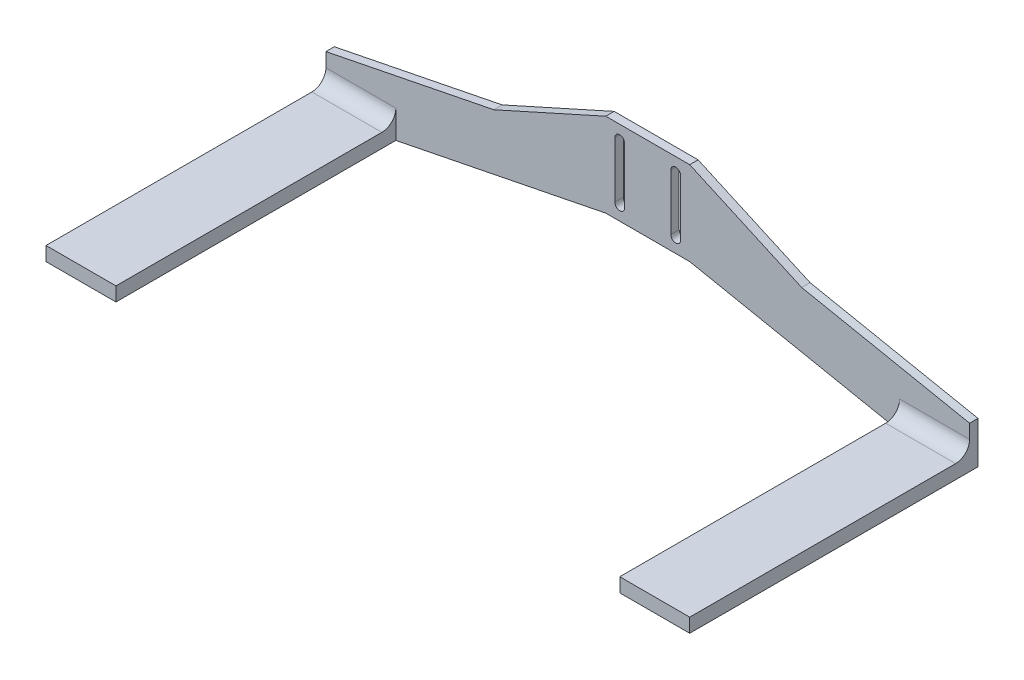
ISO-10303-21;
HEADER;
FILE_DESCRIPTION(('STEP AP214'),'2;1');
FILE_NAME('part.step','',(''),(''),'','','');
FILE_SCHEMA(('AUTOMOTIVE_DESIGN { 1 0 10303 214 1 1 1 1 }'));
ENDSEC;
DATA;
#1=APPLICATION_CONTEXT('core data for automotive mechanical design processes');
#2=APPLICATION_PROTOCOL_DEFINITION('international standard','automotive_design',2000,#1);
#3=PRODUCT_CONTEXT('',#1,'mechanical');
#4=PRODUCT('Part','Part','',(#3));
#5=PRODUCT_RELATED_PRODUCT_CATEGORY('part','',(#4));
#6=PRODUCT_DEFINITION_FORMATION('','',#4);
#7=PRODUCT_DEFINITION_CONTEXT('part definition',#1,'design');
#8=PRODUCT_DEFINITION('design','',#6,#7);
#9=PRODUCT_DEFINITION_SHAPE('','',#8);
#10=(LENGTH_UNIT() NAMED_UNIT(*) SI_UNIT(.MILLI.,.METRE.));
#11=(NAMED_UNIT(*) PLANE_ANGLE_UNIT() SI_UNIT($,.RADIAN.));
#12=(NAMED_UNIT(*) SI_UNIT($,.STERADIAN.) SOLID_ANGLE_UNIT());
#13=UNCERTAINTY_MEASURE_WITH_UNIT(LENGTH_MEASURE(1.E-05),#10,'distance_accuracy_value','');
#14=(GEOMETRIC_REPRESENTATION_CONTEXT(3) GLOBAL_UNCERTAINTY_ASSIGNED_CONTEXT((#13)) GLOBAL_UNIT_ASSIGNED_CONTEXT((#10,
#11,#12)) REPRESENTATION_CONTEXT('',''));
#15=CARTESIAN_POINT('',(0.,0.,0.));
#16=DIRECTION('',(0.,0.,1.));
#17=DIRECTION('',(1.,0.,0.));
#18=AXIS2_PLACEMENT_3D('',#15,#16,#17);
#19=CARTESIAN_POINT('',(0.,0.,3.));
#20=DIRECTION('',(0.,0.,1.));
#21=DIRECTION('',(1.,0.,0.));
#22=AXIS2_PLACEMENT_3D('',#19,#20,#21);
#23=PLANE('',#22);
#24=DIRECTION('',(0.,1.,0.));
#25=VECTOR('',#24,1.);
#26=CARTESIAN_POINT('',(90.,-30.,3.));
#27=LINE('',#26,#25);
#28=CARTESIAN_POINT('',(90.,-30.,3.));
#29=VERTEX_POINT('',#28);
#30=CARTESIAN_POINT('',(90.,-20.,3.));
#31=VERTEX_POINT('',#30);
#32=EDGE_CURVE('E238',#29,#31,#27,.T.);
#33=ORIENTED_EDGE('',*,*,#32,.T.);
#34=DIRECTION('',(1.,0.,0.));
#35=VECTOR('',#34,1.);
#36=CARTESIAN_POINT('',(115.,-20.,3.));
#37=LINE('',#36,#35);
#38=CARTESIAN_POINT('',(115.,-20.,3.));
#39=VERTEX_POINT('',#38);
#40=EDGE_CURVE('E357',#31,#39,#37,.T.);
#41=ORIENTED_EDGE('',*,*,#40,.T.);
#42=DIRECTION('',(0.,1.,0.));
#43=VECTOR('',#42,1.);
#44=CARTESIAN_POINT('',(115.,-1.06396373193244E-13,3.));
#45=LINE('',#44,#43);
#46=CARTESIAN_POINT('',(115.,-15.,3.));
#47=VERTEX_POINT('',#46);
#48=EDGE_CURVE('E380',#39,#47,#45,.T.);
#49=ORIENTED_EDGE('',*,*,#48,.T.);
#50=DIRECTION('',(-0.98058067569092,0.196116135138184,0.));
#51=VECTOR('',#50,1.);
#52=CARTESIAN_POINT('',(1.53846153846154,7.69230769230769,3.));
#53=LINE('',#52,#51);
#54=CARTESIAN_POINT('',(55.,-3.,3.));
#55=VERTEX_POINT('',#54);
#56=EDGE_CURVE('E386',#47,#55,#53,.T.);
#57=ORIENTED_EDGE('',*,*,#56,.T.);
#58=DIRECTION('',(-0.911921505175107,0.410364677328798,0.));
#59=VECTOR('',#58,1.);
#60=CARTESIAN_POINT('',(8.13929313929313,18.0873180873181,3.));
#61=LINE('',#60,#59);
#62=CARTESIAN_POINT('',(15.,15.,3.));
#63=VERTEX_POINT('',#62);
#64=EDGE_CURVE('E389',#55,#63,#61,.T.);
#65=ORIENTED_EDGE('',*,*,#64,.T.);
#66=DIRECTION('',(1.,0.,0.));
#67=VECTOR('',#66,1.);
#68=CARTESIAN_POINT('',(0.,15.,3.));
#69=LINE('',#68,#67);
#70=CARTESIAN_POINT('',(-15.,15.,3.));
#71=VERTEX_POINT('',#70);
#72=EDGE_CURVE('E396',#71,#63,#69,.T.);
#73=ORIENTED_EDGE('',*,*,#72,.F.);
#74=DIRECTION('',(0.911921505175106,0.410364677328798,0.));
#75=VECTOR('',#74,1.);
#76=CARTESIAN_POINT('',(-8.13929313929315,18.0873180873181,3.));
#77=LINE('',#76,#75);
#78=CARTESIAN_POINT('',(-55.,-3.00000000000001,3.));
#79=VERTEX_POINT('',#78);
#80=EDGE_CURVE('E399',#79,#71,#77,.T.);
#81=ORIENTED_EDGE('',*,*,#80,.F.);
#82=DIRECTION('',(0.98058067569092,0.196116135138184,0.));
#83=VECTOR('',#82,1.);
#84=CARTESIAN_POINT('',(-1.53846153846154,7.69230769230768,3.));
#85=LINE('',#84,#83);
#86=CARTESIAN_POINT('',(-115.,-15.,3.));
#87=VERTEX_POINT('',#86);
#88=EDGE_CURVE('E259',#87,#79,#85,.T.);
#89=ORIENTED_EDGE('',*,*,#88,.F.);
#90=DIRECTION('',(0.,1.,0.));
#91=VECTOR('',#90,1.);
#92=CARTESIAN_POINT('',(-115.,-1.06396373193244E-13,3.));
#93=LINE('',#92,#91);
#94=CARTESIAN_POINT('',(-115.,-20.,3.));
#95=VERTEX_POINT('',#94);
#96=EDGE_CURVE('E255',#95,#87,#93,.T.);
#97=ORIENTED_EDGE('',*,*,#96,.F.);
#98=DIRECTION('',(1.,0.,0.));
#99=VECTOR('',#98,1.);
#100=CARTESIAN_POINT('',(-90.,-20.,3.));
#101=LINE('',#100,#99);
#102=CARTESIAN_POINT('',(-90.,-20.,3.));
#103=VERTEX_POINT('',#102);
#104=EDGE_CURVE('E237',#95,#103,#101,.T.);
#105=ORIENTED_EDGE('',*,*,#104,.T.);
#106=DIRECTION('',(0.,-1.,0.));
#107=VECTOR('',#106,1.);
#108=CARTESIAN_POINT('',(-90.,-30.,3.));
#109=LINE('',#108,#107);
#110=CARTESIAN_POINT('',(-90.,-30.,3.));
#111=VERTEX_POINT('',#110);
#112=EDGE_CURVE('E219',#103,#111,#109,.T.);
#113=ORIENTED_EDGE('',*,*,#112,.T.);
#114=DIRECTION('',(-0.98058067569092,-0.196116135138184,0.));
#115=VECTOR('',#114,1.);
#116=CARTESIAN_POINT('',(2.30769230769231,-11.5384615384616,3.));
#117=LINE('',#116,#115);
#118=CARTESIAN_POINT('',(-15.,-15.,3.));
#119=VERTEX_POINT('',#118);
#120=EDGE_CURVE('E234',#119,#111,#117,.T.);
#121=ORIENTED_EDGE('',*,*,#120,.F.);
#122=DIRECTION('',(1.,0.,0.));
#123=VECTOR('',#122,1.);
#124=CARTESIAN_POINT('',(0.,-15.,3.));
#125=LINE('',#124,#123);
#126=CARTESIAN_POINT('',(15.,-15.,3.));
#127=VERTEX_POINT('',#126);
#128=EDGE_CURVE('E391',#119,#127,#125,.T.);
#129=ORIENTED_EDGE('',*,*,#128,.T.);
#130=DIRECTION('',(0.98058067569092,-0.196116135138184,0.));
#131=VECTOR('',#130,1.);
#132=CARTESIAN_POINT('',(-2.30769230769231,-11.5384615384615,3.));
#133=LINE('',#132,#131);
#134=EDGE_CURVE('E387',#127,#29,#133,.T.);
#135=ORIENTED_EDGE('',*,*,#134,.T.);
#136=EDGE_LOOP('',(#33,#41,#49,#57,#65,#73,#81,#89,#97,#105,#113,#121,#129,#135));
#137=FACE_BOUND('',#136,.T.);
#138=CARTESIAN_POINT('',(-10.,9.99999999999999,3.));
#139=DIRECTION('',(0.,0.,1.));
#140=DIRECTION('',(1.,0.,0.));
#141=AXIS2_PLACEMENT_3D('',#138,#139,#140);
#142=CIRCLE('',#141,1.74999999999997);
#143=CARTESIAN_POINT('',(-8.24999999999999,9.99999999999999,3.));
#144=VERTEX_POINT('',#143);
#145=CARTESIAN_POINT('',(-11.75,9.99999999999999,3.));
#146=VERTEX_POINT('',#145);
#147=EDGE_CURVE('E317',#144,#146,#142,.T.);
#148=ORIENTED_EDGE('',*,*,#147,.F.);
#149=DIRECTION('',(0.,-1.,0.));
#150=VECTOR('',#149,1.);
#151=CARTESIAN_POINT('',(-8.24999999999999,0.,3.));
#152=LINE('',#151,#150);
#153=CARTESIAN_POINT('',(-8.24999999999998,-10.,3.));
#154=VERTEX_POINT('',#153);
#155=EDGE_CURVE('E523',#144,#154,#152,.T.);
#156=ORIENTED_EDGE('',*,*,#155,.T.);
#157=CARTESIAN_POINT('',(-9.99999999999998,-10.,3.));
#158=DIRECTION('',(0.,0.,1.));
#159=DIRECTION('',(1.,0.,0.));
#160=AXIS2_PLACEMENT_3D('',#157,#158,#159);
#161=CIRCLE('',#160,1.74999999999997);
#162=CARTESIAN_POINT('',(-11.75,-10.,3.));
#163=VERTEX_POINT('',#162);
#164=EDGE_CURVE('E522',#163,#154,#161,.T.);
#165=ORIENTED_EDGE('',*,*,#164,.F.);
#166=DIRECTION('',(0.,-1.,0.));
#167=VECTOR('',#166,1.);
#168=CARTESIAN_POINT('',(-11.75,0.,3.));
#169=LINE('',#168,#167);
#170=EDGE_CURVE('E518',#146,#163,#169,.T.);
#171=ORIENTED_EDGE('',*,*,#170,.F.);
#172=EDGE_LOOP('',(#148,#156,#165,#171));
#173=FACE_BOUND('',#172,.T.);
#174=CARTESIAN_POINT('',(10.,-9.99999999999998,3.));
#175=DIRECTION('',(0.,0.,1.));
#176=DIRECTION('',(1.,0.,0.));
#177=AXIS2_PLACEMENT_3D('',#174,#175,#176);
#178=CIRCLE('',#177,1.75);
#179=CARTESIAN_POINT('',(8.25,-9.99999999999998,3.));
#180=VERTEX_POINT('',#179);
#181=CARTESIAN_POINT('',(11.75,-9.99999999999998,3.));
#182=VERTEX_POINT('',#181);
#183=EDGE_CURVE('E534',#180,#182,#178,.T.);
#184=ORIENTED_EDGE('',*,*,#183,.F.);
#185=DIRECTION('',(0.,-1.,0.));
#186=VECTOR('',#185,1.);
#187=CARTESIAN_POINT('',(8.25,0.,3.));
#188=LINE('',#187,#186);
#189=CARTESIAN_POINT('',(8.24999999999999,10.,3.));
#190=VERTEX_POINT('',#189);
#191=EDGE_CURVE('E537',#190,#180,#188,.T.);
#192=ORIENTED_EDGE('',*,*,#191,.F.);
#193=CARTESIAN_POINT('',(10.,10.,3.));
#194=DIRECTION('',(0.,0.,1.));
#195=DIRECTION('',(1.,0.,0.));
#196=AXIS2_PLACEMENT_3D('',#193,#194,#195);
#197=CIRCLE('',#196,1.75);
#198=CARTESIAN_POINT('',(11.75,10.,3.));
#199=VERTEX_POINT('',#198);
#200=EDGE_CURVE('E540',#199,#190,#197,.T.);
#201=ORIENTED_EDGE('',*,*,#200,.F.);
#202=DIRECTION('',(0.,-1.,0.));
#203=VECTOR('',#202,1.);
#204=CARTESIAN_POINT('',(11.75,0.,3.));
#205=LINE('',#204,#203);
#206=EDGE_CURVE('E543',#199,#182,#205,.T.);
#207=ORIENTED_EDGE('',*,*,#206,.T.);
#208=EDGE_LOOP('',(#184,#192,#201,#207));
#209=FACE_BOUND('',#208,.T.);
#210=ADVANCED_FACE('F41',(#137,#173,#209),#23,.T.);
#211=CARTESIAN_POINT('',(0.,-15.,3.));
#212=DIRECTION('',(0.,1.,0.));
#213=DIRECTION('',(-1.,0.,0.));
#214=AXIS2_PLACEMENT_3D('',#211,#212,#213);
#215=PLANE('',#214);
#216=DIRECTION('',(1.,0.,0.));
#217=VECTOR('',#216,1.);
#218=CARTESIAN_POINT('',(0.,-15.,0.));
#219=LINE('',#218,#217);
#220=CARTESIAN_POINT('',(-15.,-15.,0.));
#221=VERTEX_POINT('',#220);
#222=CARTESIAN_POINT('',(15.,-15.,0.));
#223=VERTEX_POINT('',#222);
#224=EDGE_CURVE('E288',#221,#223,#219,.T.);
#225=ORIENTED_EDGE('',*,*,#224,.T.);
#226=DIRECTION('',(0.,0.,-1.));
#227=VECTOR('',#226,1.);
#228=CARTESIAN_POINT('',(15.,-15.,3.));
#229=LINE('',#228,#227);
#230=EDGE_CURVE('E341',#127,#223,#229,.T.);
#231=ORIENTED_EDGE('',*,*,#230,.F.);
#232=ORIENTED_EDGE('',*,*,#128,.F.);
#233=DIRECTION('',(0.,0.,-1.));
#234=VECTOR('',#233,1.);
#235=CARTESIAN_POINT('',(-15.,-15.,3.));
#236=LINE('',#235,#234);
#237=EDGE_CURVE('E250',#119,#221,#236,.T.);
#238=ORIENTED_EDGE('',*,*,#237,.T.);
#239=EDGE_LOOP('',(#225,#231,#232,#238));
#240=FACE_BOUND('',#239,.T.);
#241=ADVANCED_FACE('F430',(#240),#215,.F.);
#242=CARTESIAN_POINT('',(-2.30769230769231,-11.5384615384615,3.));
#243=DIRECTION('',(0.196116135138184,0.98058067569092,0.));
#244=DIRECTION('',(-0.98058067569092,0.196116135138184,0.));
#245=AXIS2_PLACEMENT_3D('',#242,#243,#244);
#246=PLANE('',#245);
#247=DIRECTION('',(0.98058067569092,-0.196116135138184,0.));
#248=VECTOR('',#247,1.);
#249=CARTESIAN_POINT('',(-2.30769230769231,-11.5384615384615,0.));
#250=LINE('',#249,#248);
#251=CARTESIAN_POINT('',(90.,-30.,0.));
#252=VERTEX_POINT('',#251);
#253=EDGE_CURVE('E291',#223,#252,#250,.T.);
#254=ORIENTED_EDGE('',*,*,#253,.T.);
#255=DIRECTION('',(0.,0.,-1.));
#256=VECTOR('',#255,1.);
#257=CARTESIAN_POINT('',(90.,-30.,3.));
#258=LINE('',#257,#256);
#259=EDGE_CURVE('E338',#29,#252,#258,.T.);
#260=ORIENTED_EDGE('',*,*,#259,.F.);
#261=ORIENTED_EDGE('',*,*,#134,.F.);
#262=ORIENTED_EDGE('',*,*,#230,.T.);
#263=EDGE_LOOP('',(#254,#260,#261,#262));
#264=FACE_BOUND('',#263,.T.);
#265=ADVANCED_FACE('F435',(#264),#246,.F.);
#266=CARTESIAN_POINT('',(0.,-30.,3.));
#267=DIRECTION('',(0.,1.,0.));
#268=DIRECTION('',(-1.,0.,0.));
#269=AXIS2_PLACEMENT_3D('',#266,#267,#268);
#270=PLANE('',#269);
#271=DIRECTION('',(1.,0.,0.));
#272=VECTOR('',#271,1.);
#273=CARTESIAN_POINT('',(0.,-30.,0.));
#274=LINE('',#273,#272);
#275=CARTESIAN_POINT('',(115.,-30.,0.));
#276=VERTEX_POINT('',#275);
#277=EDGE_CURVE('E293',#252,#276,#274,.T.);
#278=ORIENTED_EDGE('',*,*,#277,.T.);
#279=DIRECTION('',(0.,0.,-1.));
#280=VECTOR('',#279,1.);
#281=CARTESIAN_POINT('',(115.,-30.,3.));
#282=LINE('',#281,#280);
#283=CARTESIAN_POINT('',(115.,-30.,103.));
#284=VERTEX_POINT('',#283);
#285=EDGE_CURVE('E335',#284,#276,#282,.T.);
#286=ORIENTED_EDGE('',*,*,#285,.F.);
#287=DIRECTION('',(-1.,0.,0.));
#288=VECTOR('',#287,1.);
#289=CARTESIAN_POINT('',(115.,-30.,103.));
#290=LINE('',#289,#288);
#291=CARTESIAN_POINT('',(90.,-30.,103.));
#292=VERTEX_POINT('',#291);
#293=EDGE_CURVE('E558',#284,#292,#290,.T.);
#294=ORIENTED_EDGE('',*,*,#293,.T.);
#295=DIRECTION('',(0.,0.,-1.));
#296=VECTOR('',#295,1.);
#297=CARTESIAN_POINT('',(90.,-30.,103.));
#298=LINE('',#297,#296);
#299=EDGE_CURVE('E529',#292,#29,#298,.T.);
#300=ORIENTED_EDGE('',*,*,#299,.T.);
#301=ORIENTED_EDGE('',*,*,#259,.T.);
#302=EDGE_LOOP('',(#278,#286,#294,#300,#301));
#303=FACE_BOUND('',#302,.T.);
#304=ADVANCED_FACE('F471',(#303),#270,.F.);
#305=CARTESIAN_POINT('',(115.,-1.06396373193244E-13,3.));
#306=DIRECTION('',(-1.,0.,0.));
#307=DIRECTION('',(0.,-1.,0.));
#308=AXIS2_PLACEMENT_3D('',#305,#306,#307);
#309=PLANE('',#308);
#310=DIRECTION('',(0.,1.,0.));
#311=VECTOR('',#310,1.);
#312=CARTESIAN_POINT('',(115.,-1.06396373193244E-13,0.));
#313=LINE('',#312,#311);
#314=CARTESIAN_POINT('',(115.,-15.,0.));
#315=VERTEX_POINT('',#314);
#316=EDGE_CURVE('E295',#276,#315,#313,.T.);
#317=ORIENTED_EDGE('',*,*,#316,.T.);
#318=DIRECTION('',(0.,0.,-1.));
#319=VECTOR('',#318,1.);
#320=CARTESIAN_POINT('',(115.,-15.,3.));
#321=LINE('',#320,#319);
#322=EDGE_CURVE('E332',#47,#315,#321,.T.);
#323=ORIENTED_EDGE('',*,*,#322,.F.);
#324=ORIENTED_EDGE('',*,*,#48,.F.);
#325=CARTESIAN_POINT('',(115.,-20.,8.));
#326=DIRECTION('',(-1.,0.,0.));
#327=DIRECTION('',(0.,-1.,0.));
#328=AXIS2_PLACEMENT_3D('',#325,#326,#327);
#329=CIRCLE('',#328,5.);
#330=CARTESIAN_POINT('',(115.,-25.,8.00000000000001));
#331=VERTEX_POINT('',#330);
#332=EDGE_CURVE('E363',#39,#331,#329,.T.);
#333=ORIENTED_EDGE('',*,*,#332,.T.);
#334=DIRECTION('',(0.,0.,-1.));
#335=VECTOR('',#334,1.);
#336=CARTESIAN_POINT('',(115.,-25.,103.));
#337=LINE('',#336,#335);
#338=CARTESIAN_POINT('',(115.,-25.,103.));
#339=VERTEX_POINT('',#338);
#340=EDGE_CURVE('E267',#339,#331,#337,.T.);
#341=ORIENTED_EDGE('',*,*,#340,.F.);
#342=DIRECTION('',(0.,-1.,0.));
#343=VECTOR('',#342,1.);
#344=CARTESIAN_POINT('',(115.,-25.,103.));
#345=LINE('',#344,#343);
#346=EDGE_CURVE('E556',#339,#284,#345,.T.);
#347=ORIENTED_EDGE('',*,*,#346,.T.);
#348=ORIENTED_EDGE('',*,*,#285,.T.);
#349=EDGE_LOOP('',(#317,#323,#324,#333,#341,#347,#348));
#350=FACE_BOUND('',#349,.T.);
#351=ADVANCED_FACE('F383',(#350),#309,.F.);
#352=CARTESIAN_POINT('',(1.53846153846154,7.69230769230769,3.));
#353=DIRECTION('',(-0.196116135138184,-0.98058067569092,0.));
#354=DIRECTION('',(0.98058067569092,-0.196116135138184,0.));
#355=AXIS2_PLACEMENT_3D('',#352,#353,#354);
#356=PLANE('',#355);
#357=DIRECTION('',(-0.98058067569092,0.196116135138184,0.));
#358=VECTOR('',#357,1.);
#359=CARTESIAN_POINT('',(1.53846153846154,7.69230769230769,0.));
#360=LINE('',#359,#358);
#361=CARTESIAN_POINT('',(55.,-3.,0.));
#362=VERTEX_POINT('',#361);
#363=EDGE_CURVE('E297',#315,#362,#360,.T.);
#364=ORIENTED_EDGE('',*,*,#363,.T.);
#365=DIRECTION('',(0.,0.,-1.));
#366=VECTOR('',#365,1.);
#367=CARTESIAN_POINT('',(55.,-3.,3.));
#368=LINE('',#367,#366);
#369=EDGE_CURVE('E329',#55,#362,#368,.T.);
#370=ORIENTED_EDGE('',*,*,#369,.F.);
#371=ORIENTED_EDGE('',*,*,#56,.F.);
#372=ORIENTED_EDGE('',*,*,#322,.T.);
#373=EDGE_LOOP('',(#364,#370,#371,#372));
#374=FACE_BOUND('',#373,.T.);
#375=ADVANCED_FACE('F464',(#374),#356,.F.);
#376=CARTESIAN_POINT('',(8.13929313929313,18.0873180873181,3.));
#377=DIRECTION('',(-0.410364677328798,-0.911921505175106,0.));
#378=DIRECTION('',(0.911921505175107,-0.410364677328798,0.));
#379=AXIS2_PLACEMENT_3D('',#376,#377,#378);
#380=PLANE('',#379);
#381=DIRECTION('',(-0.911921505175107,0.410364677328798,0.));
#382=VECTOR('',#381,1.);
#383=CARTESIAN_POINT('',(8.13929313929313,18.0873180873181,0.));
#384=LINE('',#383,#382);
#385=CARTESIAN_POINT('',(15.,15.,0.));
#386=VERTEX_POINT('',#385);
#387=EDGE_CURVE('E299',#362,#386,#384,.T.);
#388=ORIENTED_EDGE('',*,*,#387,.T.);
#389=DIRECTION('',(0.,0.,-1.));
#390=VECTOR('',#389,1.);
#391=CARTESIAN_POINT('',(15.,15.,3.));
#392=LINE('',#391,#390);
#393=EDGE_CURVE('E327',#63,#386,#392,.T.);
#394=ORIENTED_EDGE('',*,*,#393,.F.);
#395=ORIENTED_EDGE('',*,*,#64,.F.);
#396=ORIENTED_EDGE('',*,*,#369,.T.);
#397=EDGE_LOOP('',(#388,#394,#395,#396));
#398=FACE_BOUND('',#397,.T.);
#399=ADVANCED_FACE('F460',(#398),#380,.F.);
#400=CARTESIAN_POINT('',(0.,15.,3.));
#401=DIRECTION('',(0.,1.,0.));
#402=DIRECTION('',(-1.,0.,0.));
#403=AXIS2_PLACEMENT_3D('',#400,#401,#402);
#404=PLANE('',#403);
#405=DIRECTION('',(1.,0.,0.));
#406=VECTOR('',#405,1.);
#407=CARTESIAN_POINT('',(0.,15.,0.));
#408=LINE('',#407,#406);
#409=CARTESIAN_POINT('',(-15.,15.,0.));
#410=VERTEX_POINT('',#409);
#411=EDGE_CURVE('E302',#410,#386,#408,.T.);
#412=ORIENTED_EDGE('',*,*,#411,.F.);
#413=DIRECTION('',(0.,0.,-1.));
#414=VECTOR('',#413,1.);
#415=CARTESIAN_POINT('',(-15.,15.,3.));
#416=LINE('',#415,#414);
#417=EDGE_CURVE('E325',#71,#410,#416,.T.);
#418=ORIENTED_EDGE('',*,*,#417,.F.);
#419=ORIENTED_EDGE('',*,*,#72,.T.);
#420=ORIENTED_EDGE('',*,*,#393,.T.);
#421=EDGE_LOOP('',(#412,#418,#419,#420));
#422=FACE_BOUND('',#421,.T.);
#423=ADVANCED_FACE('F457',(#422),#404,.T.);
#424=CARTESIAN_POINT('',(-8.13929313929315,18.0873180873181,3.));
#425=DIRECTION('',(-0.410364677328798,0.911921505175106,0.));
#426=DIRECTION('',(-0.911921505175106,-0.410364677328798,0.));
#427=AXIS2_PLACEMENT_3D('',#424,#425,#426);
#428=PLANE('',#427);
#429=DIRECTION('',(0.911921505175106,0.410364677328798,0.));
#430=VECTOR('',#429,1.);
#431=CARTESIAN_POINT('',(-8.13929313929315,18.0873180873181,0.));
#432=LINE('',#431,#430);
#433=CARTESIAN_POINT('',(-55.,-3.00000000000001,0.));
#434=VERTEX_POINT('',#433);
#435=EDGE_CURVE('E305',#434,#410,#432,.T.);
#436=ORIENTED_EDGE('',*,*,#435,.F.);
#437=DIRECTION('',(0.,0.,-1.));
#438=VECTOR('',#437,1.);
#439=CARTESIAN_POINT('',(-55.,-3.00000000000001,3.));
#440=LINE('',#439,#438);
#441=EDGE_CURVE('E323',#79,#434,#440,.T.);
#442=ORIENTED_EDGE('',*,*,#441,.F.);
#443=ORIENTED_EDGE('',*,*,#80,.T.);
#444=ORIENTED_EDGE('',*,*,#417,.T.);
#445=EDGE_LOOP('',(#436,#442,#443,#444));
#446=FACE_BOUND('',#445,.T.);
#447=ADVANCED_FACE('F411',(#446),#428,.T.);
#448=CARTESIAN_POINT('',(-1.53846153846154,7.69230769230768,3.));
#449=DIRECTION('',(-0.196116135138184,0.98058067569092,0.));
#450=DIRECTION('',(-0.98058067569092,-0.196116135138184,0.));
#451=AXIS2_PLACEMENT_3D('',#448,#449,#450);
#452=PLANE('',#451);
#453=DIRECTION('',(0.98058067569092,0.196116135138184,0.));
#454=VECTOR('',#453,1.);
#455=CARTESIAN_POINT('',(-1.53846153846154,7.69230769230768,0.));
#456=LINE('',#455,#454);
#457=CARTESIAN_POINT('',(-115.,-15.,0.));
#458=VERTEX_POINT('',#457);
#459=EDGE_CURVE('E308',#458,#434,#456,.T.);
#460=ORIENTED_EDGE('',*,*,#459,.F.);
#461=DIRECTION('',(0.,0.,-1.));
#462=VECTOR('',#461,1.);
#463=CARTESIAN_POINT('',(-115.,-15.,3.));
#464=LINE('',#463,#462);
#465=EDGE_CURVE('E321',#87,#458,#464,.T.);
#466=ORIENTED_EDGE('',*,*,#465,.F.);
#467=ORIENTED_EDGE('',*,*,#88,.T.);
#468=ORIENTED_EDGE('',*,*,#441,.T.);
#469=EDGE_LOOP('',(#460,#466,#467,#468));
#470=FACE_BOUND('',#469,.T.);
#471=ADVANCED_FACE('F406',(#470),#452,.T.);
#472=CARTESIAN_POINT('',(-115.,-1.06396373193244E-13,3.));
#473=DIRECTION('',(-1.,0.,0.));
#474=DIRECTION('',(0.,-1.,0.));
#475=AXIS2_PLACEMENT_3D('',#472,#473,#474);
#476=PLANE('',#475);
#477=DIRECTION('',(0.,1.,0.));
#478=VECTOR('',#477,1.);
#479=CARTESIAN_POINT('',(-115.,-1.06396373193244E-13,0.));
#480=LINE('',#479,#478);
#481=CARTESIAN_POINT('',(-115.,-30.,0.));
#482=VERTEX_POINT('',#481);
#483=EDGE_CURVE('E311',#482,#458,#480,.T.);
#484=ORIENTED_EDGE('',*,*,#483,.F.);
#485=DIRECTION('',(0.,0.,-1.));
#486=VECTOR('',#485,1.);
#487=CARTESIAN_POINT('',(-115.,-30.,3.));
#488=LINE('',#487,#486);
#489=CARTESIAN_POINT('',(-115.,-30.,103.));
#490=VERTEX_POINT('',#489);
#491=EDGE_CURVE('E249',#490,#482,#488,.T.);
#492=ORIENTED_EDGE('',*,*,#491,.F.);
#493=DIRECTION('',(0.,1.,0.));
#494=VECTOR('',#493,1.);
#495=CARTESIAN_POINT('',(-115.,-30.,103.));
#496=LINE('',#495,#494);
#497=CARTESIAN_POINT('',(-115.,-25.,103.));
#498=VERTEX_POINT('',#497);
#499=EDGE_CURVE('E598',#490,#498,#496,.T.);
#500=ORIENTED_EDGE('',*,*,#499,.T.);
#501=DIRECTION('',(0.,0.,-1.));
#502=VECTOR('',#501,1.);
#503=CARTESIAN_POINT('',(-115.,-25.,103.));
#504=LINE('',#503,#502);
#505=CARTESIAN_POINT('',(-115.,-25.,8.00000000000001));
#506=VERTEX_POINT('',#505);
#507=EDGE_CURVE('E422',#498,#506,#504,.T.);
#508=ORIENTED_EDGE('',*,*,#507,.T.);
#509=CARTESIAN_POINT('',(-115.,-20.,8.));
#510=DIRECTION('',(-1.,0.,0.));
#511=DIRECTION('',(0.,-1.,0.));
#512=AXIS2_PLACEMENT_3D('',#509,#510,#511);
#513=CIRCLE('',#512,5.);
#514=EDGE_CURVE('E11',#506,#95,#513,.F.);
#515=ORIENTED_EDGE('',*,*,#514,.T.);
#516=ORIENTED_EDGE('',*,*,#96,.T.);
#517=ORIENTED_EDGE('',*,*,#465,.T.);
#518=EDGE_LOOP('',(#484,#492,#500,#508,#515,#516,#517));
#519=FACE_BOUND('',#518,.T.);
#520=ADVANCED_FACE('F418',(#519),#476,.T.);
#521=CARTESIAN_POINT('',(0.,-30.,3.));
#522=DIRECTION('',(0.,-1.,0.));
#523=DIRECTION('',(1.,0.,0.));
#524=AXIS2_PLACEMENT_3D('',#521,#522,#523);
#525=PLANE('',#524);
#526=DIRECTION('',(-1.,0.,0.));
#527=VECTOR('',#526,1.);
#528=CARTESIAN_POINT('',(0.,-30.,0.));
#529=LINE('',#528,#527);
#530=CARTESIAN_POINT('',(-90.,-30.,0.));
#531=VERTEX_POINT('',#530);
#532=EDGE_CURVE('E245',#531,#482,#529,.T.);
#533=ORIENTED_EDGE('',*,*,#532,.F.);
#534=DIRECTION('',(0.,0.,-1.));
#535=VECTOR('',#534,1.);
#536=CARTESIAN_POINT('',(-90.,-30.,3.));
#537=LINE('',#536,#535);
#538=EDGE_CURVE('E242',#111,#531,#537,.T.);
#539=ORIENTED_EDGE('',*,*,#538,.F.);
#540=DIRECTION('',(0.,0.,-1.));
#541=VECTOR('',#540,1.);
#542=CARTESIAN_POINT('',(-90.,-30.,103.));
#543=LINE('',#542,#541);
#544=CARTESIAN_POINT('',(-90.,-30.,103.));
#545=VERTEX_POINT('',#544);
#546=EDGE_CURVE('E216',#545,#111,#543,.T.);
#547=ORIENTED_EDGE('',*,*,#546,.F.);
#548=DIRECTION('',(-1.,0.,0.));
#549=VECTOR('',#548,1.);
#550=CARTESIAN_POINT('',(-115.,-30.,103.));
#551=LINE('',#550,#549);
#552=EDGE_CURVE('E239',#545,#490,#551,.T.);
#553=ORIENTED_EDGE('',*,*,#552,.T.);
#554=ORIENTED_EDGE('',*,*,#491,.T.);
#555=EDGE_LOOP('',(#533,#539,#547,#553,#554));
#556=FACE_BOUND('',#555,.T.);
#557=ADVANCED_FACE('F243',(#556),#525,.T.);
#558=CARTESIAN_POINT('',(10.,-9.99999999999998,3.));
#559=DIRECTION('',(0.,0.,-1.));
#560=DIRECTION('',(-1.,0.,0.));
#561=AXIS2_PLACEMENT_3D('',#558,#559,#560);
#562=CYLINDRICAL_SURFACE('',#561,1.75);
#563=CARTESIAN_POINT('',(10.,-9.99999999999998,0.));
#564=DIRECTION('',(0.,0.,1.));
#565=DIRECTION('',(1.,0.,0.));
#566=AXIS2_PLACEMENT_3D('',#563,#564,#565);
#567=CIRCLE('',#566,1.75);
#568=CARTESIAN_POINT('',(8.25,-9.99999999999998,0.));
#569=VERTEX_POINT('',#568);
#570=CARTESIAN_POINT('',(11.75,-9.99999999999998,0.));
#571=VERTEX_POINT('',#570);
#572=EDGE_CURVE('E276',#569,#571,#567,.T.);
#573=ORIENTED_EDGE('',*,*,#572,.F.);
#574=DIRECTION('',(0.,0.,-1.));
#575=VECTOR('',#574,1.);
#576=CARTESIAN_POINT('',(8.25,-9.99999999999998,3.));
#577=LINE('',#576,#575);
#578=EDGE_CURVE('E318',#180,#569,#577,.T.);
#579=ORIENTED_EDGE('',*,*,#578,.F.);
#580=ORIENTED_EDGE('',*,*,#183,.T.);
#581=DIRECTION('',(0.,0.,-1.));
#582=VECTOR('',#581,1.);
#583=CARTESIAN_POINT('',(11.75,-9.99999999999998,3.));
#584=LINE('',#583,#582);
#585=EDGE_CURVE('E344',#182,#571,#584,.T.);
#586=ORIENTED_EDGE('',*,*,#585,.T.);
#587=EDGE_LOOP('',(#573,#579,#580,#586));
#588=FACE_BOUND('',#587,.T.);
#589=ADVANCED_FACE('F450',(#588),#562,.F.);
#590=CARTESIAN_POINT('',(8.25,0.,3.));
#591=DIRECTION('',(1.,0.,0.));
#592=DIRECTION('',(0.,1.,0.));
#593=AXIS2_PLACEMENT_3D('',#590,#591,#592);
#594=PLANE('',#593);
#595=DIRECTION('',(0.,-1.,0.));
#596=VECTOR('',#595,1.);
#597=CARTESIAN_POINT('',(8.25,0.,0.));
#598=LINE('',#597,#596);
#599=CARTESIAN_POINT('',(8.24999999999999,10.,0.));
#600=VERTEX_POINT('',#599);
#601=EDGE_CURVE('E279',#600,#569,#598,.T.);
#602=ORIENTED_EDGE('',*,*,#601,.F.);
#603=DIRECTION('',(0.,0.,-1.));
#604=VECTOR('',#603,1.);
#605=CARTESIAN_POINT('',(8.24999999999999,10.,3.));
#606=LINE('',#605,#604);
#607=EDGE_CURVE('E349',#190,#600,#606,.T.);
#608=ORIENTED_EDGE('',*,*,#607,.F.);
#609=ORIENTED_EDGE('',*,*,#191,.T.);
#610=ORIENTED_EDGE('',*,*,#578,.T.);
#611=EDGE_LOOP('',(#602,#608,#609,#610));
#612=FACE_BOUND('',#611,.T.);
#613=ADVANCED_FACE('F487',(#612),#594,.T.);
#614=CARTESIAN_POINT('',(10.,10.,3.));
#615=DIRECTION('',(0.,0.,-1.));
#616=DIRECTION('',(-1.,0.,0.));
#617=AXIS2_PLACEMENT_3D('',#614,#615,#616);
#618=CYLINDRICAL_SURFACE('',#617,1.75);
#619=CARTESIAN_POINT('',(10.,10.,0.));
#620=DIRECTION('',(0.,0.,1.));
#621=DIRECTION('',(1.,0.,0.));
#622=AXIS2_PLACEMENT_3D('',#619,#620,#621);
#623=CIRCLE('',#622,1.75);
#624=CARTESIAN_POINT('',(11.75,10.,0.));
#625=VERTEX_POINT('',#624);
#626=EDGE_CURVE('E282',#625,#600,#623,.T.);
#627=ORIENTED_EDGE('',*,*,#626,.F.);
#628=DIRECTION('',(0.,0.,-1.));
#629=VECTOR('',#628,1.);
#630=CARTESIAN_POINT('',(11.75,10.,3.));
#631=LINE('',#630,#629);
#632=EDGE_CURVE('E346',#199,#625,#631,.T.);
#633=ORIENTED_EDGE('',*,*,#632,.F.);
#634=ORIENTED_EDGE('',*,*,#200,.T.);
#635=ORIENTED_EDGE('',*,*,#607,.T.);
#636=EDGE_LOOP('',(#627,#633,#634,#635));
#637=FACE_BOUND('',#636,.T.);
#638=ADVANCED_FACE('F483',(#637),#618,.F.);
#639=CARTESIAN_POINT('',(-10.,9.99999999999999,3.));
#640=DIRECTION('',(0.,0.,-1.));
#641=DIRECTION('',(-1.,0.,0.));
#642=AXIS2_PLACEMENT_3D('',#639,#640,#641);
#643=CYLINDRICAL_SURFACE('',#642,1.74999999999997);
#644=CARTESIAN_POINT('',(-10.,9.99999999999999,0.));
#645=DIRECTION('',(0.,0.,1.));
#646=DIRECTION('',(1.,0.,0.));
#647=AXIS2_PLACEMENT_3D('',#644,#645,#646);
#648=CIRCLE('',#647,1.74999999999997);
#649=CARTESIAN_POINT('',(-8.24999999999999,9.99999999999999,0.));
#650=VERTEX_POINT('',#649);
#651=CARTESIAN_POINT('',(-11.75,9.99999999999999,0.));
#652=VERTEX_POINT('',#651);
#653=EDGE_CURVE('E263',#650,#652,#648,.T.);
#654=ORIENTED_EDGE('',*,*,#653,.F.);
#655=DIRECTION('',(0.,0.,-1.));
#656=VECTOR('',#655,1.);
#657=CARTESIAN_POINT('',(-8.24999999999999,9.99999999999999,3.));
#658=LINE('',#657,#656);
#659=EDGE_CURVE('E347',#144,#650,#658,.T.);
#660=ORIENTED_EDGE('',*,*,#659,.F.);
#661=ORIENTED_EDGE('',*,*,#147,.T.);
#662=DIRECTION('',(0.,0.,-1.));
#663=VECTOR('',#662,1.);
#664=CARTESIAN_POINT('',(-11.75,9.99999999999999,3.));
#665=LINE('',#664,#663);
#666=EDGE_CURVE('E254',#146,#652,#665,.T.);
#667=ORIENTED_EDGE('',*,*,#666,.T.);
#668=EDGE_LOOP('',(#654,#660,#661,#667));
#669=FACE_BOUND('',#668,.T.);
#670=ADVANCED_FACE('F486',(#669),#643,.F.);
#671=CARTESIAN_POINT('',(-8.24999999999999,0.,3.));
#672=DIRECTION('',(1.,0.,0.));
#673=DIRECTION('',(0.,1.,0.));
#674=AXIS2_PLACEMENT_3D('',#671,#672,#673);
#675=PLANE('',#674);
#676=DIRECTION('',(0.,-1.,0.));
#677=VECTOR('',#676,1.);
#678=CARTESIAN_POINT('',(-8.24999999999999,0.,0.));
#679=LINE('',#678,#677);
#680=CARTESIAN_POINT('',(-8.24999999999998,-10.,0.));
#681=VERTEX_POINT('',#680);
#682=EDGE_CURVE('E266',#650,#681,#679,.T.);
#683=ORIENTED_EDGE('',*,*,#682,.T.);
#684=DIRECTION('',(0.,0.,-1.));
#685=VECTOR('',#684,1.);
#686=CARTESIAN_POINT('',(-8.24999999999998,-10.,3.));
#687=LINE('',#686,#685);
#688=EDGE_CURVE('E353',#154,#681,#687,.T.);
#689=ORIENTED_EDGE('',*,*,#688,.F.);
#690=ORIENTED_EDGE('',*,*,#155,.F.);
#691=ORIENTED_EDGE('',*,*,#659,.T.);
#692=EDGE_LOOP('',(#683,#689,#690,#691));
#693=FACE_BOUND('',#692,.T.);
#694=ADVANCED_FACE('F500',(#693),#675,.F.);
#695=CARTESIAN_POINT('',(-9.99999999999998,-10.,3.));
#696=DIRECTION('',(0.,0.,-1.));
#697=DIRECTION('',(-1.,0.,0.));
#698=AXIS2_PLACEMENT_3D('',#695,#696,#697);
#699=CYLINDRICAL_SURFACE('',#698,1.74999999999997);
#700=CARTESIAN_POINT('',(-9.99999999999998,-10.,0.));
#701=DIRECTION('',(0.,0.,1.));
#702=DIRECTION('',(1.,0.,0.));
#703=AXIS2_PLACEMENT_3D('',#700,#701,#702);
#704=CIRCLE('',#703,1.74999999999997);
#705=CARTESIAN_POINT('',(-11.75,-10.,0.));
#706=VERTEX_POINT('',#705);
#707=EDGE_CURVE('E270',#706,#681,#704,.T.);
#708=ORIENTED_EDGE('',*,*,#707,.F.);
#709=DIRECTION('',(0.,0.,-1.));
#710=VECTOR('',#709,1.);
#711=CARTESIAN_POINT('',(-11.75,-10.,3.));
#712=LINE('',#711,#710);
#713=EDGE_CURVE('E257',#163,#706,#712,.T.);
#714=ORIENTED_EDGE('',*,*,#713,.F.);
#715=ORIENTED_EDGE('',*,*,#164,.T.);
#716=ORIENTED_EDGE('',*,*,#688,.T.);
#717=EDGE_LOOP('',(#708,#714,#715,#716));
#718=FACE_BOUND('',#717,.T.);
#719=ADVANCED_FACE('F481',(#718),#699,.F.);
#720=CARTESIAN_POINT('',(11.75,0.,3.));
#721=DIRECTION('',(1.,0.,0.));
#722=DIRECTION('',(0.,1.,0.));
#723=AXIS2_PLACEMENT_3D('',#720,#721,#722);
#724=PLANE('',#723);
#725=DIRECTION('',(0.,-1.,0.));
#726=VECTOR('',#725,1.);
#727=CARTESIAN_POINT('',(11.75,0.,0.));
#728=LINE('',#727,#726);
#729=EDGE_CURVE('E285',#625,#571,#728,.T.);
#730=ORIENTED_EDGE('',*,*,#729,.T.);
#731=ORIENTED_EDGE('',*,*,#585,.F.);
#732=ORIENTED_EDGE('',*,*,#206,.F.);
#733=ORIENTED_EDGE('',*,*,#632,.T.);
#734=EDGE_LOOP('',(#730,#731,#732,#733));
#735=FACE_BOUND('',#734,.T.);
#736=ADVANCED_FACE('F478',(#735),#724,.F.);
#737=CARTESIAN_POINT('',(-11.75,0.,3.));
#738=DIRECTION('',(1.,0.,0.));
#739=DIRECTION('',(0.,1.,0.));
#740=AXIS2_PLACEMENT_3D('',#737,#738,#739);
#741=PLANE('',#740);
#742=DIRECTION('',(0.,-1.,0.));
#743=VECTOR('',#742,1.);
#744=CARTESIAN_POINT('',(-11.75,0.,0.));
#745=LINE('',#744,#743);
#746=EDGE_CURVE('E273',#652,#706,#745,.T.);
#747=ORIENTED_EDGE('',*,*,#746,.F.);
#748=ORIENTED_EDGE('',*,*,#666,.F.);
#749=ORIENTED_EDGE('',*,*,#170,.T.);
#750=ORIENTED_EDGE('',*,*,#713,.T.);
#751=EDGE_LOOP('',(#747,#748,#749,#750));
#752=FACE_BOUND('',#751,.T.);
#753=ADVANCED_FACE('F447',(#752),#741,.T.);
#754=CARTESIAN_POINT('',(2.30769230769231,-11.5384615384616,3.));
#755=DIRECTION('',(0.196116135138184,-0.98058067569092,0.));
#756=DIRECTION('',(0.98058067569092,0.196116135138184,0.));
#757=AXIS2_PLACEMENT_3D('',#754,#755,#756);
#758=PLANE('',#757);
#759=DIRECTION('',(-0.98058067569092,-0.196116135138184,0.));
#760=VECTOR('',#759,1.);
#761=CARTESIAN_POINT('',(2.30769230769231,-11.5384615384616,0.));
#762=LINE('',#761,#760);
#763=EDGE_CURVE('E315',#221,#531,#762,.T.);
#764=ORIENTED_EDGE('',*,*,#763,.F.);
#765=ORIENTED_EDGE('',*,*,#237,.F.);
#766=ORIENTED_EDGE('',*,*,#120,.T.);
#767=ORIENTED_EDGE('',*,*,#538,.T.);
#768=EDGE_LOOP('',(#764,#765,#766,#767));
#769=FACE_BOUND('',#768,.T.);
#770=ADVANCED_FACE('F252',(#769),#758,.T.);
#771=CARTESIAN_POINT('',(0.,0.,0.));
#772=DIRECTION('',(0.,0.,1.));
#773=DIRECTION('',(1.,0.,0.));
#774=AXIS2_PLACEMENT_3D('',#771,#772,#773);
#775=PLANE('',#774);
#776=ORIENTED_EDGE('',*,*,#653,.T.);
#777=ORIENTED_EDGE('',*,*,#746,.T.);
#778=ORIENTED_EDGE('',*,*,#707,.T.);
#779=ORIENTED_EDGE('',*,*,#682,.F.);
#780=EDGE_LOOP('',(#776,#777,#778,#779));
#781=FACE_BOUND('',#780,.T.);
#782=ORIENTED_EDGE('',*,*,#572,.T.);
#783=ORIENTED_EDGE('',*,*,#729,.F.);
#784=ORIENTED_EDGE('',*,*,#626,.T.);
#785=ORIENTED_EDGE('',*,*,#601,.T.);
#786=EDGE_LOOP('',(#782,#783,#784,#785));
#787=FACE_BOUND('',#786,.T.);
#788=ORIENTED_EDGE('',*,*,#224,.F.);
#789=ORIENTED_EDGE('',*,*,#763,.T.);
#790=ORIENTED_EDGE('',*,*,#532,.T.);
#791=ORIENTED_EDGE('',*,*,#483,.T.);
#792=ORIENTED_EDGE('',*,*,#459,.T.);
#793=ORIENTED_EDGE('',*,*,#435,.T.);
#794=ORIENTED_EDGE('',*,*,#411,.T.);
#795=ORIENTED_EDGE('',*,*,#387,.F.);
#796=ORIENTED_EDGE('',*,*,#363,.F.);
#797=ORIENTED_EDGE('',*,*,#316,.F.);
#798=ORIENTED_EDGE('',*,*,#277,.F.);
#799=ORIENTED_EDGE('',*,*,#253,.F.);
#800=EDGE_LOOP('',(#788,#789,#790,#791,#792,#793,#794,#795,#796,#797,#798,#799));
#801=FACE_BOUND('',#800,.T.);
#802=ADVANCED_FACE('F415',(#781,#787,#801),#775,.F.);
#803=CARTESIAN_POINT('',(90.,-25.,103.));
#804=DIRECTION('',(0.,1.,0.));
#805=DIRECTION('',(-1.,0.,0.));
#806=AXIS2_PLACEMENT_3D('',#803,#804,#805);
#807=PLANE('',#806);
#808=ORIENTED_EDGE('',*,*,#340,.T.);
#809=DIRECTION('',(1.,0.,0.));
#810=VECTOR('',#809,1.);
#811=CARTESIAN_POINT('',(90.,-25.,8.));
#812=LINE('',#811,#810);
#813=CARTESIAN_POINT('',(90.,-25.,8.00000000000001));
#814=VERTEX_POINT('',#813);
#815=EDGE_CURVE('E360',#331,#814,#812,.F.);
#816=ORIENTED_EDGE('',*,*,#815,.T.);
#817=DIRECTION('',(0.,0.,-1.));
#818=VECTOR('',#817,1.);
#819=CARTESIAN_POINT('',(90.,-25.,103.));
#820=LINE('',#819,#818);
#821=CARTESIAN_POINT('',(90.,-25.,103.));
#822=VERTEX_POINT('',#821);
#823=EDGE_CURVE('E375',#822,#814,#820,.T.);
#824=ORIENTED_EDGE('',*,*,#823,.F.);
#825=DIRECTION('',(1.,0.,0.));
#826=VECTOR('',#825,1.);
#827=CARTESIAN_POINT('',(90.,-25.,103.));
#828=LINE('',#827,#826);
#829=EDGE_CURVE('E566',#822,#339,#828,.T.);
#830=ORIENTED_EDGE('',*,*,#829,.T.);
#831=EDGE_LOOP('',(#808,#816,#824,#830));
#832=FACE_BOUND('',#831,.T.);
#833=ADVANCED_FACE('F443',(#832),#807,.T.);
#834=CARTESIAN_POINT('',(90.,-30.,103.));
#835=DIRECTION('',(-1.,0.,0.));
#836=DIRECTION('',(0.,0.,1.));
#837=AXIS2_PLACEMENT_3D('',#834,#835,#836);
#838=PLANE('',#837);
#839=ORIENTED_EDGE('',*,*,#32,.F.);
#840=ORIENTED_EDGE('',*,*,#299,.F.);
#841=DIRECTION('',(0.,1.,0.));
#842=VECTOR('',#841,1.);
#843=CARTESIAN_POINT('',(90.,-30.,103.));
#844=LINE('',#843,#842);
#845=EDGE_CURVE('E564',#292,#822,#844,.T.);
#846=ORIENTED_EDGE('',*,*,#845,.T.);
#847=ORIENTED_EDGE('',*,*,#823,.T.);
#848=CARTESIAN_POINT('',(90.,-20.,8.));
#849=DIRECTION('',(-1.,0.,0.));
#850=DIRECTION('',(0.,0.,1.));
#851=AXIS2_PLACEMENT_3D('',#848,#849,#850);
#852=CIRCLE('',#851,5.);
#853=EDGE_CURVE('E365',#814,#31,#852,.F.);
#854=ORIENTED_EDGE('',*,*,#853,.T.);
#855=EDGE_LOOP('',(#839,#840,#846,#847,#854));
#856=FACE_BOUND('',#855,.T.);
#857=ADVANCED_FACE('F372',(#856),#838,.T.);
#858=CARTESIAN_POINT('',(0.,0.,103.));
#859=DIRECTION('',(0.,0.,-1.));
#860=DIRECTION('',(-1.,0.,0.));
#861=AXIS2_PLACEMENT_3D('',#858,#859,#860);
#862=PLANE('',#861);
#863=ORIENTED_EDGE('',*,*,#346,.F.);
#864=ORIENTED_EDGE('',*,*,#829,.F.);
#865=ORIENTED_EDGE('',*,*,#845,.F.);
#866=ORIENTED_EDGE('',*,*,#293,.F.);
#867=EDGE_LOOP('',(#863,#864,#865,#866));
#868=FACE_BOUND('',#867,.T.);
#869=ADVANCED_FACE('F561',(#868),#862,.F.);
#870=CARTESIAN_POINT('',(-90.,-30.,103.));
#871=DIRECTION('',(1.,0.,0.));
#872=DIRECTION('',(0.,0.,-1.));
#873=AXIS2_PLACEMENT_3D('',#870,#871,#872);
#874=PLANE('',#873);
#875=ORIENTED_EDGE('',*,*,#112,.F.);
#876=CARTESIAN_POINT('',(-90.,-20.,8.));
#877=DIRECTION('',(1.,0.,0.));
#878=DIRECTION('',(0.,0.,-1.));
#879=AXIS2_PLACEMENT_3D('',#876,#877,#878);
#880=CIRCLE('',#879,5.);
#881=CARTESIAN_POINT('',(-90.,-25.,8.00000000000001));
#882=VERTEX_POINT('',#881);
#883=EDGE_CURVE('E49',#103,#882,#880,.F.);
#884=ORIENTED_EDGE('',*,*,#883,.T.);
#885=DIRECTION('',(0.,0.,-1.));
#886=VECTOR('',#885,1.);
#887=CARTESIAN_POINT('',(-90.,-25.,103.));
#888=LINE('',#887,#886);
#889=CARTESIAN_POINT('',(-90.,-25.,103.));
#890=VERTEX_POINT('',#889);
#891=EDGE_CURVE('E226',#890,#882,#888,.T.);
#892=ORIENTED_EDGE('',*,*,#891,.F.);
#893=DIRECTION('',(0.,-1.,0.));
#894=VECTOR('',#893,1.);
#895=CARTESIAN_POINT('',(-90.,-30.,103.));
#896=LINE('',#895,#894);
#897=EDGE_CURVE('E221',#890,#545,#896,.T.);
#898=ORIENTED_EDGE('',*,*,#897,.T.);
#899=ORIENTED_EDGE('',*,*,#546,.T.);
#900=EDGE_LOOP('',(#875,#884,#892,#898,#899));
#901=FACE_BOUND('',#900,.T.);
#902=ADVANCED_FACE('F218',(#901),#874,.T.);
#903=CARTESIAN_POINT('',(-90.,-25.,103.));
#904=DIRECTION('',(0.,1.,0.));
#905=DIRECTION('',(0.,0.,1.));
#906=AXIS2_PLACEMENT_3D('',#903,#904,#905);
#907=PLANE('',#906);
#908=ORIENTED_EDGE('',*,*,#891,.T.);
#909=DIRECTION('',(1.,0.,0.));
#910=VECTOR('',#909,1.);
#911=CARTESIAN_POINT('',(-115.,-25.,8.));
#912=LINE('',#911,#910);
#913=EDGE_CURVE('E62',#882,#506,#912,.F.);
#914=ORIENTED_EDGE('',*,*,#913,.T.);
#915=ORIENTED_EDGE('',*,*,#507,.F.);
#916=DIRECTION('',(1.,0.,0.));
#917=VECTOR('',#916,1.);
#918=CARTESIAN_POINT('',(-90.,-25.,103.));
#919=LINE('',#918,#917);
#920=EDGE_CURVE('E592',#498,#890,#919,.T.);
#921=ORIENTED_EDGE('',*,*,#920,.T.);
#922=EDGE_LOOP('',(#908,#914,#915,#921));
#923=FACE_BOUND('',#922,.T.);
#924=ADVANCED_FACE('F583',(#923),#907,.T.);
#925=CARTESIAN_POINT('',(0.,0.,103.));
#926=DIRECTION('',(0.,0.,1.));
#927=DIRECTION('',(1.,0.,0.));
#928=AXIS2_PLACEMENT_3D('',#925,#926,#927);
#929=PLANE('',#928);
#930=ORIENTED_EDGE('',*,*,#552,.F.);
#931=ORIENTED_EDGE('',*,*,#897,.F.);
#932=ORIENTED_EDGE('',*,*,#920,.F.);
#933=ORIENTED_EDGE('',*,*,#499,.F.);
#934=EDGE_LOOP('',(#930,#931,#932,#933));
#935=FACE_BOUND('',#934,.T.);
#936=ADVANCED_FACE('F428',(#935),#929,.T.);
#937=CARTESIAN_POINT('',(0.,-20.,8.));
#938=DIRECTION('',(-1.,0.,0.));
#939=DIRECTION('',(0.,-1.,0.));
#940=AXIS2_PLACEMENT_3D('',#937,#938,#939);
#941=CYLINDRICAL_SURFACE('',#940,5.);
#942=ORIENTED_EDGE('',*,*,#853,.F.);
#943=ORIENTED_EDGE('',*,*,#815,.F.);
#944=ORIENTED_EDGE('',*,*,#332,.F.);
#945=ORIENTED_EDGE('',*,*,#40,.F.);
#946=EDGE_LOOP('',(#942,#943,#944,#945));
#947=FACE_BOUND('',#946,.T.);
#948=ADVANCED_FACE('F378',(#947),#941,.F.);
#949=CARTESIAN_POINT('',(0.,-20.,8.));
#950=DIRECTION('',(-1.,0.,0.));
#951=DIRECTION('',(0.,0.,1.));
#952=AXIS2_PLACEMENT_3D('',#949,#950,#951);
#953=CYLINDRICAL_SURFACE('',#952,5.);
#954=ORIENTED_EDGE('',*,*,#514,.F.);
#955=ORIENTED_EDGE('',*,*,#913,.F.);
#956=ORIENTED_EDGE('',*,*,#883,.F.);
#957=ORIENTED_EDGE('',*,*,#104,.F.);
#958=EDGE_LOOP('',(#954,#955,#956,#957));
#959=FACE_BOUND('',#958,.T.);
#960=ADVANCED_FACE('F43',(#959),#953,.F.);
#961=CLOSED_SHELL('',(#210,#241,#265,#304,#351,#375,#399,#423,#447,#471,#520,#557,#589,#613,
#638,#670,#694,#719,#736,#753,#770,#802,#833,#857,#869,#902,#924,#936,#948,#960));
#962=MANIFOLD_SOLID_BREP('B2',#961);
#963=ADVANCED_BREP_SHAPE_REPRESENTATION('',(#18,#962),#14);
#964=SHAPE_DEFINITION_REPRESENTATION(#9,#963);
ENDSEC;
END-ISO-10303-21;
